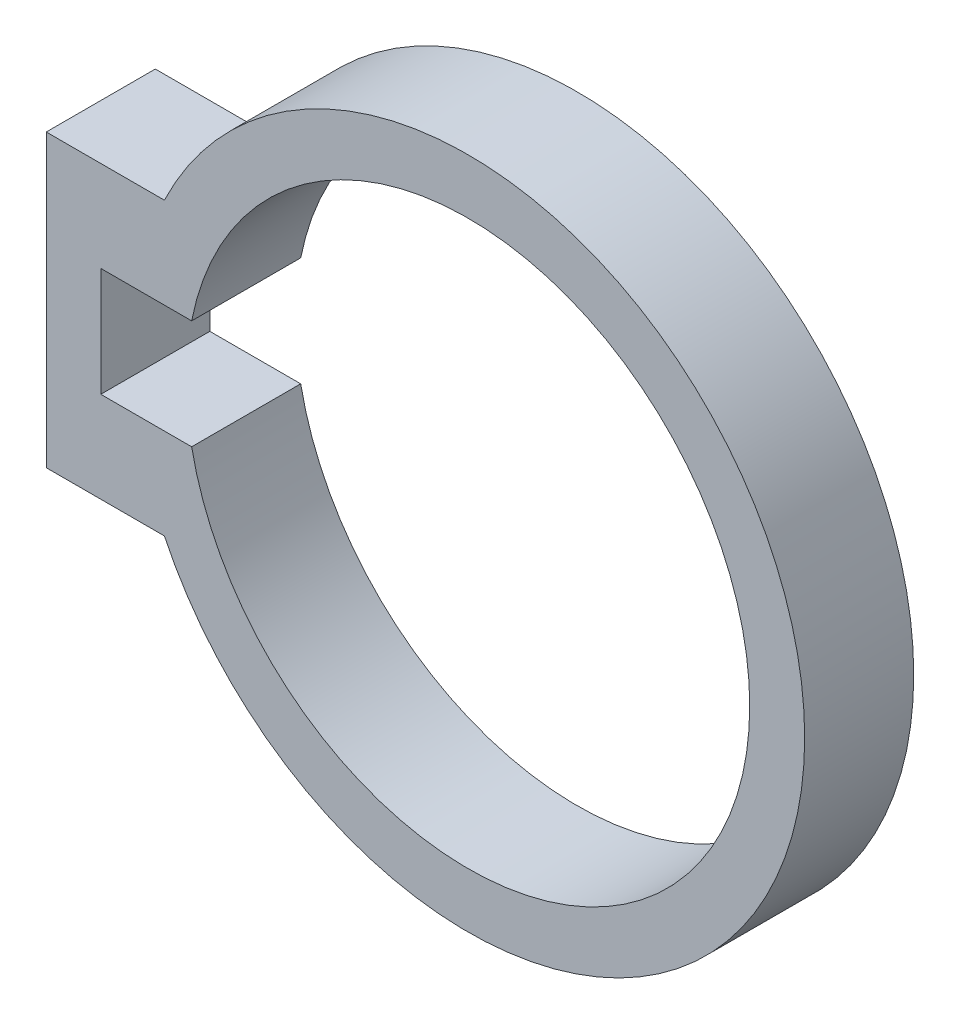
ISO-10303-21;
HEADER;
FILE_DESCRIPTION(('STEP AP214'),'2;1');
FILE_NAME('part.step','',(''),(''),'','','');
FILE_SCHEMA(('AUTOMOTIVE_DESIGN { 1 0 10303 214 1 1 1 1 }'));
ENDSEC;
DATA;
#1=APPLICATION_CONTEXT('core data for automotive mechanical design processes');
#2=APPLICATION_PROTOCOL_DEFINITION('international standard','automotive_design',2000,#1);
#3=PRODUCT_CONTEXT('',#1,'mechanical');
#4=PRODUCT('Part','Part','',(#3));
#5=PRODUCT_RELATED_PRODUCT_CATEGORY('part','',(#4));
#6=PRODUCT_DEFINITION_FORMATION('','',#4);
#7=PRODUCT_DEFINITION_CONTEXT('part definition',#1,'design');
#8=PRODUCT_DEFINITION('design','',#6,#7);
#9=PRODUCT_DEFINITION_SHAPE('','',#8);
#10=(LENGTH_UNIT() NAMED_UNIT(*) SI_UNIT(.MILLI.,.METRE.));
#11=(NAMED_UNIT(*) PLANE_ANGLE_UNIT() SI_UNIT($,.RADIAN.));
#12=(NAMED_UNIT(*) SI_UNIT($,.STERADIAN.) SOLID_ANGLE_UNIT());
#13=UNCERTAINTY_MEASURE_WITH_UNIT(LENGTH_MEASURE(1.E-05),#10,'distance_accuracy_value','');
#14=(GEOMETRIC_REPRESENTATION_CONTEXT(3) GLOBAL_UNCERTAINTY_ASSIGNED_CONTEXT((#13)) GLOBAL_UNIT_ASSIGNED_CONTEXT((#10,
#11,#12)) REPRESENTATION_CONTEXT('',''));
#15=CARTESIAN_POINT('',(0.,0.,0.));
#16=DIRECTION('',(0.,0.,1.));
#17=DIRECTION('',(1.,0.,0.));
#18=AXIS2_PLACEMENT_3D('',#15,#16,#17);
#19=CARTESIAN_POINT('',(23.2069063257455,-8.,6.));
#20=DIRECTION('',(0.,0.,-1.));
#21=DIRECTION('',(-1.,0.,0.));
#22=AXIS2_PLACEMENT_3D('',#19,#20,#21);
#23=PLANE('',#22);
#24=DIRECTION('',(0.,-1.,0.));
#25=VECTOR('',#24,1.);
#26=CARTESIAN_POINT('',(0.,0.,6.));
#27=LINE('',#26,#25);
#28=CARTESIAN_POINT('',(0.,0.,6.));
#29=VERTEX_POINT('',#28);
#30=CARTESIAN_POINT('',(0.,-16.,6.));
#31=VERTEX_POINT('',#30);
#32=EDGE_CURVE('E135',#29,#31,#27,.T.);
#33=ORIENTED_EDGE('',*,*,#32,.T.);
#34=DIRECTION('',(1.,0.,0.));
#35=VECTOR('',#34,1.);
#36=CARTESIAN_POINT('',(0.,-16.,6.));
#37=LINE('',#36,#35);
#38=CARTESIAN_POINT('',(6.5,-16.,6.));
#39=VERTEX_POINT('',#38);
#40=EDGE_CURVE('E138',#31,#39,#37,.T.);
#41=ORIENTED_EDGE('',*,*,#40,.T.);
#42=CARTESIAN_POINT('',(23.2069063257455,-8.,6.));
#43=DIRECTION('',(0.,0.,1.));
#44=DIRECTION('',(-1.,0.,0.));
#45=AXIS2_PLACEMENT_3D('',#42,#43,#44);
#46=CIRCLE('',#45,18.5235179967855);
#47=CARTESIAN_POINT('',(6.5,0.,6.));
#48=VERTEX_POINT('',#47);
#49=EDGE_CURVE('E141',#39,#48,#46,.T.);
#50=ORIENTED_EDGE('',*,*,#49,.T.);
#51=DIRECTION('',(-1.,0.,0.));
#52=VECTOR('',#51,1.);
#53=CARTESIAN_POINT('',(0.,0.,6.));
#54=LINE('',#53,#52);
#55=EDGE_CURVE('E143',#48,#29,#54,.T.);
#56=ORIENTED_EDGE('',*,*,#55,.T.);
#57=EDGE_LOOP('',(#33,#41,#50,#56));
#58=FACE_BOUND('',#57,.T.);
#59=CARTESIAN_POINT('',(23.2069063257455,-7.99999999999999,6.));
#60=DIRECTION('',(0.,0.,1.));
#61=DIRECTION('',(-1.,0.,0.));
#62=AXIS2_PLACEMENT_3D('',#59,#60,#61);
#63=CIRCLE('',#62,15.5);
#64=CARTESIAN_POINT('',(8.,-11.,6.));
#65=VERTEX_POINT('',#64);
#66=CARTESIAN_POINT('',(8.,-5.,6.));
#67=VERTEX_POINT('',#66);
#68=EDGE_CURVE('E99',#65,#67,#63,.T.);
#69=ORIENTED_EDGE('',*,*,#68,.F.);
#70=DIRECTION('',(1.,0.,0.));
#71=VECTOR('',#70,1.);
#72=CARTESIAN_POINT('',(3.,-11.,6.));
#73=LINE('',#72,#71);
#74=CARTESIAN_POINT('',(3.,-11.,6.));
#75=VERTEX_POINT('',#74);
#76=EDGE_CURVE('E121',#75,#65,#73,.T.);
#77=ORIENTED_EDGE('',*,*,#76,.F.);
#78=DIRECTION('',(0.,-1.,0.));
#79=VECTOR('',#78,1.);
#80=CARTESIAN_POINT('',(3.,-5.,6.));
#81=LINE('',#80,#79);
#82=CARTESIAN_POINT('',(3.,-5.,6.));
#83=VERTEX_POINT('',#82);
#84=EDGE_CURVE('E119',#83,#75,#81,.T.);
#85=ORIENTED_EDGE('',*,*,#84,.F.);
#86=DIRECTION('',(-1.,0.,0.));
#87=VECTOR('',#86,1.);
#88=CARTESIAN_POINT('',(3.,-5.,6.));
#89=LINE('',#88,#87);
#90=EDGE_CURVE('E107',#67,#83,#89,.T.);
#91=ORIENTED_EDGE('',*,*,#90,.F.);
#92=EDGE_LOOP('',(#69,#77,#85,#91));
#93=FACE_BOUND('',#92,.T.);
#94=ADVANCED_FACE('F34',(#58,#93),#23,.F.);
#95=CARTESIAN_POINT('',(23.2069063257455,-8.,0.));
#96=DIRECTION('',(0.,0.,-1.));
#97=DIRECTION('',(-1.,0.,0.));
#98=AXIS2_PLACEMENT_3D('',#95,#96,#97);
#99=PLANE('',#98);
#100=DIRECTION('',(0.,-1.,0.));
#101=VECTOR('',#100,1.);
#102=CARTESIAN_POINT('',(0.,0.,0.));
#103=LINE('',#102,#101);
#104=CARTESIAN_POINT('',(0.,0.,0.));
#105=VERTEX_POINT('',#104);
#106=CARTESIAN_POINT('',(0.,-16.,0.));
#107=VERTEX_POINT('',#106);
#108=EDGE_CURVE('E115',#105,#107,#103,.T.);
#109=ORIENTED_EDGE('',*,*,#108,.F.);
#110=DIRECTION('',(-1.,0.,0.));
#111=VECTOR('',#110,1.);
#112=CARTESIAN_POINT('',(0.,0.,0.));
#113=LINE('',#112,#111);
#114=CARTESIAN_POINT('',(6.5,0.,0.));
#115=VERTEX_POINT('',#114);
#116=EDGE_CURVE('E139',#115,#105,#113,.T.);
#117=ORIENTED_EDGE('',*,*,#116,.F.);
#118=CARTESIAN_POINT('',(23.2069063257455,-8.,0.));
#119=DIRECTION('',(0.,0.,1.));
#120=DIRECTION('',(-1.,0.,0.));
#121=AXIS2_PLACEMENT_3D('',#118,#119,#120);
#122=CIRCLE('',#121,18.5235179967855);
#123=CARTESIAN_POINT('',(6.5,-16.,0.));
#124=VERTEX_POINT('',#123);
#125=EDGE_CURVE('E150',#124,#115,#122,.T.);
#126=ORIENTED_EDGE('',*,*,#125,.F.);
#127=DIRECTION('',(1.,0.,0.));
#128=VECTOR('',#127,1.);
#129=CARTESIAN_POINT('',(0.,-16.,0.));
#130=LINE('',#129,#128);
#131=EDGE_CURVE('E148',#107,#124,#130,.T.);
#132=ORIENTED_EDGE('',*,*,#131,.F.);
#133=EDGE_LOOP('',(#109,#117,#126,#132));
#134=FACE_BOUND('',#133,.T.);
#135=DIRECTION('',(1.,0.,0.));
#136=VECTOR('',#135,1.);
#137=CARTESIAN_POINT('',(3.,-11.,0.));
#138=LINE('',#137,#136);
#139=CARTESIAN_POINT('',(3.,-11.,0.));
#140=VERTEX_POINT('',#139);
#141=CARTESIAN_POINT('',(8.,-11.,0.));
#142=VERTEX_POINT('',#141);
#143=EDGE_CURVE('E108',#140,#142,#138,.T.);
#144=ORIENTED_EDGE('',*,*,#143,.T.);
#145=CARTESIAN_POINT('',(23.2069063257455,-7.99999999999999,0.));
#146=DIRECTION('',(0.,0.,1.));
#147=DIRECTION('',(-1.,0.,0.));
#148=AXIS2_PLACEMENT_3D('',#145,#146,#147);
#149=CIRCLE('',#148,15.5);
#150=CARTESIAN_POINT('',(8.,-5.,0.));
#151=VERTEX_POINT('',#150);
#152=EDGE_CURVE('E57',#142,#151,#149,.T.);
#153=ORIENTED_EDGE('',*,*,#152,.T.);
#154=DIRECTION('',(-1.,0.,0.));
#155=VECTOR('',#154,1.);
#156=CARTESIAN_POINT('',(3.,-5.,0.));
#157=LINE('',#156,#155);
#158=CARTESIAN_POINT('',(3.,-5.,0.));
#159=VERTEX_POINT('',#158);
#160=EDGE_CURVE('E114',#151,#159,#157,.T.);
#161=ORIENTED_EDGE('',*,*,#160,.T.);
#162=DIRECTION('',(0.,-1.,0.));
#163=VECTOR('',#162,1.);
#164=CARTESIAN_POINT('',(3.,-5.,0.));
#165=LINE('',#164,#163);
#166=EDGE_CURVE('E127',#159,#140,#165,.T.);
#167=ORIENTED_EDGE('',*,*,#166,.T.);
#168=EDGE_LOOP('',(#144,#153,#161,#167));
#169=FACE_BOUND('',#168,.T.);
#170=ADVANCED_FACE('F168',(#134,#169),#99,.T.);
#171=CARTESIAN_POINT('',(0.,0.,6.));
#172=DIRECTION('',(1.,0.,0.));
#173=DIRECTION('',(0.,1.,0.));
#174=AXIS2_PLACEMENT_3D('',#171,#172,#173);
#175=PLANE('',#174);
#176=ORIENTED_EDGE('',*,*,#108,.T.);
#177=DIRECTION('',(0.,0.,-1.));
#178=VECTOR('',#177,1.);
#179=CARTESIAN_POINT('',(0.,-16.,6.));
#180=LINE('',#179,#178);
#181=EDGE_CURVE('E11',#31,#107,#180,.T.);
#182=ORIENTED_EDGE('',*,*,#181,.F.);
#183=ORIENTED_EDGE('',*,*,#32,.F.);
#184=DIRECTION('',(0.,0.,-1.));
#185=VECTOR('',#184,1.);
#186=CARTESIAN_POINT('',(0.,0.,6.));
#187=LINE('',#186,#185);
#188=EDGE_CURVE('E145',#29,#105,#187,.T.);
#189=ORIENTED_EDGE('',*,*,#188,.T.);
#190=EDGE_LOOP('',(#176,#182,#183,#189));
#191=FACE_BOUND('',#190,.T.);
#192=ADVANCED_FACE('F36',(#191),#175,.F.);
#193=CARTESIAN_POINT('',(0.,-16.,6.));
#194=DIRECTION('',(0.,1.,0.));
#195=DIRECTION('',(0.,0.,1.));
#196=AXIS2_PLACEMENT_3D('',#193,#194,#195);
#197=PLANE('',#196);
#198=ORIENTED_EDGE('',*,*,#131,.T.);
#199=DIRECTION('',(0.,0.,-1.));
#200=VECTOR('',#199,1.);
#201=CARTESIAN_POINT('',(6.5,-16.,6.));
#202=LINE('',#201,#200);
#203=EDGE_CURVE('E42',#39,#124,#202,.T.);
#204=ORIENTED_EDGE('',*,*,#203,.F.);
#205=ORIENTED_EDGE('',*,*,#40,.F.);
#206=ORIENTED_EDGE('',*,*,#181,.T.);
#207=EDGE_LOOP('',(#198,#204,#205,#206));
#208=FACE_BOUND('',#207,.T.);
#209=ADVANCED_FACE('F178',(#208),#197,.F.);
#210=CARTESIAN_POINT('',(23.2069063257455,-8.,6.));
#211=DIRECTION('',(0.,0.,-1.));
#212=DIRECTION('',(-1.,0.,0.));
#213=AXIS2_PLACEMENT_3D('',#210,#211,#212);
#214=CYLINDRICAL_SURFACE('',#213,18.5235179967855);
#215=ORIENTED_EDGE('',*,*,#125,.T.);
#216=DIRECTION('',(0.,0.,-1.));
#217=VECTOR('',#216,1.);
#218=CARTESIAN_POINT('',(6.5,0.,6.));
#219=LINE('',#218,#217);
#220=EDGE_CURVE('E155',#48,#115,#219,.T.);
#221=ORIENTED_EDGE('',*,*,#220,.F.);
#222=ORIENTED_EDGE('',*,*,#49,.F.);
#223=ORIENTED_EDGE('',*,*,#203,.T.);
#224=EDGE_LOOP('',(#215,#221,#222,#223));
#225=FACE_BOUND('',#224,.T.);
#226=ADVANCED_FACE('F162',(#225),#214,.T.);
#227=CARTESIAN_POINT('',(0.,0.,6.));
#228=DIRECTION('',(0.,-1.,0.));
#229=DIRECTION('',(0.,0.,-1.));
#230=AXIS2_PLACEMENT_3D('',#227,#228,#229);
#231=PLANE('',#230);
#232=ORIENTED_EDGE('',*,*,#116,.T.);
#233=ORIENTED_EDGE('',*,*,#188,.F.);
#234=ORIENTED_EDGE('',*,*,#55,.F.);
#235=ORIENTED_EDGE('',*,*,#220,.T.);
#236=EDGE_LOOP('',(#232,#233,#234,#235));
#237=FACE_BOUND('',#236,.T.);
#238=ADVANCED_FACE('F172',(#237),#231,.F.);
#239=CARTESIAN_POINT('',(23.2069063257455,-7.99999999999999,6.));
#240=DIRECTION('',(0.,0.,-1.));
#241=DIRECTION('',(-1.,0.,0.));
#242=AXIS2_PLACEMENT_3D('',#239,#240,#241);
#243=CYLINDRICAL_SURFACE('',#242,15.5);
#244=ORIENTED_EDGE('',*,*,#152,.F.);
#245=DIRECTION('',(0.,0.,-1.));
#246=VECTOR('',#245,1.);
#247=CARTESIAN_POINT('',(8.,-11.,6.));
#248=LINE('',#247,#246);
#249=EDGE_CURVE('E103',#65,#142,#248,.T.);
#250=ORIENTED_EDGE('',*,*,#249,.F.);
#251=ORIENTED_EDGE('',*,*,#68,.T.);
#252=DIRECTION('',(0.,0.,-1.));
#253=VECTOR('',#252,1.);
#254=CARTESIAN_POINT('',(8.,-5.,6.));
#255=LINE('',#254,#253);
#256=EDGE_CURVE('E102',#67,#151,#255,.T.);
#257=ORIENTED_EDGE('',*,*,#256,.T.);
#258=EDGE_LOOP('',(#244,#250,#251,#257));
#259=FACE_BOUND('',#258,.T.);
#260=ADVANCED_FACE('F101',(#259),#243,.F.);
#261=CARTESIAN_POINT('',(3.,-5.,6.));
#262=DIRECTION('',(0.,-1.,0.));
#263=DIRECTION('',(0.,0.,-1.));
#264=AXIS2_PLACEMENT_3D('',#261,#262,#263);
#265=PLANE('',#264);
#266=ORIENTED_EDGE('',*,*,#160,.F.);
#267=ORIENTED_EDGE('',*,*,#256,.F.);
#268=ORIENTED_EDGE('',*,*,#90,.T.);
#269=DIRECTION('',(0.,0.,-1.));
#270=VECTOR('',#269,1.);
#271=CARTESIAN_POINT('',(3.,-5.,6.));
#272=LINE('',#271,#270);
#273=EDGE_CURVE('E116',#83,#159,#272,.T.);
#274=ORIENTED_EDGE('',*,*,#273,.T.);
#275=EDGE_LOOP('',(#266,#267,#268,#274));
#276=FACE_BOUND('',#275,.T.);
#277=ADVANCED_FACE('F111',(#276),#265,.T.);
#278=CARTESIAN_POINT('',(3.,-5.,6.));
#279=DIRECTION('',(1.,0.,0.));
#280=DIRECTION('',(0.,0.,-1.));
#281=AXIS2_PLACEMENT_3D('',#278,#279,#280);
#282=PLANE('',#281);
#283=ORIENTED_EDGE('',*,*,#166,.F.);
#284=ORIENTED_EDGE('',*,*,#273,.F.);
#285=ORIENTED_EDGE('',*,*,#84,.T.);
#286=DIRECTION('',(0.,0.,-1.));
#287=VECTOR('',#286,1.);
#288=CARTESIAN_POINT('',(3.,-11.,6.));
#289=LINE('',#288,#287);
#290=EDGE_CURVE('E49',#75,#140,#289,.T.);
#291=ORIENTED_EDGE('',*,*,#290,.T.);
#292=EDGE_LOOP('',(#283,#284,#285,#291));
#293=FACE_BOUND('',#292,.T.);
#294=ADVANCED_FACE('F201',(#293),#282,.T.);
#295=CARTESIAN_POINT('',(3.,-11.,6.));
#296=DIRECTION('',(0.,1.,0.));
#297=DIRECTION('',(0.,0.,1.));
#298=AXIS2_PLACEMENT_3D('',#295,#296,#297);
#299=PLANE('',#298);
#300=ORIENTED_EDGE('',*,*,#143,.F.);
#301=ORIENTED_EDGE('',*,*,#290,.F.);
#302=ORIENTED_EDGE('',*,*,#76,.T.);
#303=ORIENTED_EDGE('',*,*,#249,.T.);
#304=EDGE_LOOP('',(#300,#301,#302,#303));
#305=FACE_BOUND('',#304,.T.);
#306=ADVANCED_FACE('F205',(#305),#299,.T.);
#307=CLOSED_SHELL('',(#94,#170,#192,#209,#226,#238,#260,#277,#294,#306));
#308=MANIFOLD_SOLID_BREP('B2',#307);
#309=ADVANCED_BREP_SHAPE_REPRESENTATION('',(#18,#308),#14);
#310=SHAPE_DEFINITION_REPRESENTATION(#9,#309);
ENDSEC;
END-ISO-10303-21;
